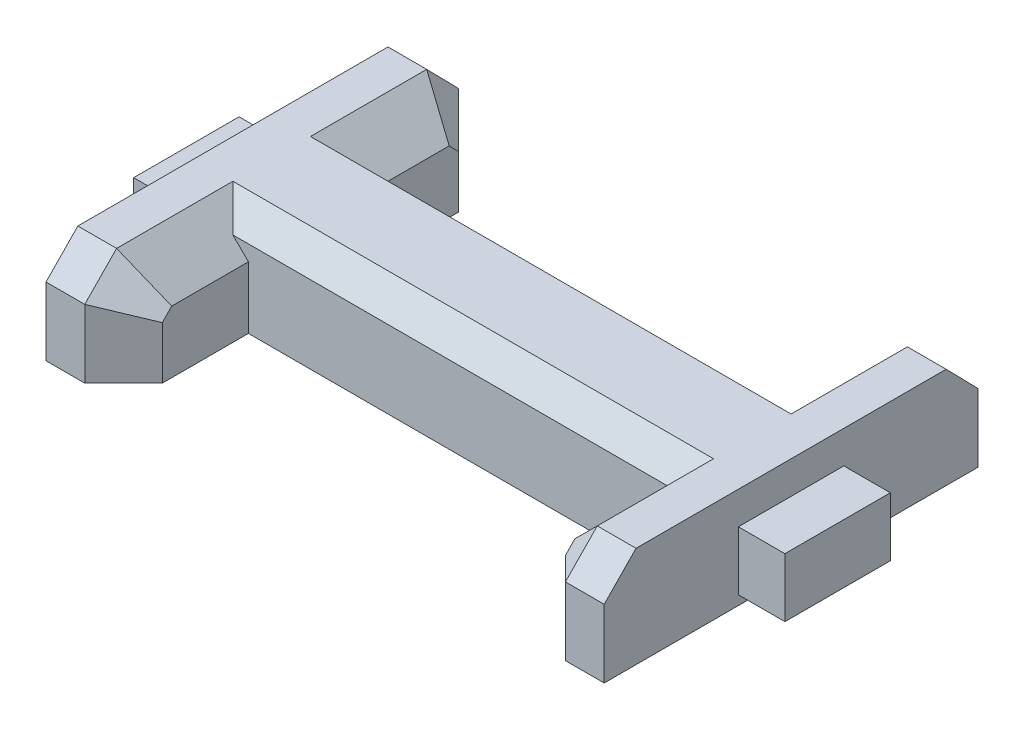
ISO-10303-21;
HEADER;
FILE_DESCRIPTION(('STEP AP214'),'2;1');
FILE_NAME('part.step','',(''),(''),'','','');
FILE_SCHEMA(('AUTOMOTIVE_DESIGN { 1 0 10303 214 1 1 1 1 }'));
ENDSEC;
DATA;
#1=APPLICATION_CONTEXT('core data for automotive mechanical design processes');
#2=APPLICATION_PROTOCOL_DEFINITION('international standard','automotive_design',2000,#1);
#3=PRODUCT_CONTEXT('',#1,'mechanical');
#4=PRODUCT('Part','Part','',(#3));
#5=PRODUCT_RELATED_PRODUCT_CATEGORY('part','',(#4));
#6=PRODUCT_DEFINITION_FORMATION('','',#4);
#7=PRODUCT_DEFINITION_CONTEXT('part definition',#1,'design');
#8=PRODUCT_DEFINITION('design','',#6,#7);
#9=PRODUCT_DEFINITION_SHAPE('','',#8);
#10=(LENGTH_UNIT() NAMED_UNIT(*) SI_UNIT(.MILLI.,.METRE.));
#11=(NAMED_UNIT(*) PLANE_ANGLE_UNIT() SI_UNIT($,.RADIAN.));
#12=(NAMED_UNIT(*) SI_UNIT($,.STERADIAN.) SOLID_ANGLE_UNIT());
#13=UNCERTAINTY_MEASURE_WITH_UNIT(LENGTH_MEASURE(1.E-05),#10,'distance_accuracy_value','');
#14=(GEOMETRIC_REPRESENTATION_CONTEXT(3) GLOBAL_UNCERTAINTY_ASSIGNED_CONTEXT((#13)) GLOBAL_UNIT_ASSIGNED_CONTEXT((#10,
#11,#12)) REPRESENTATION_CONTEXT('',''));
#15=CARTESIAN_POINT('',(0.,0.,0.));
#16=DIRECTION('',(0.,0.,1.));
#17=DIRECTION('',(1.,0.,0.));
#18=AXIS2_PLACEMENT_3D('',#15,#16,#17);
#19=CARTESIAN_POINT('',(-18.,-2.5,4.));
#20=DIRECTION('',(0.,0.,1.));
#21=DIRECTION('',(1.,0.,0.));
#22=AXIS2_PLACEMENT_3D('',#19,#20,#21);
#23=PLANE('',#22);
#24=DIRECTION('',(1.,0.,0.));
#25=VECTOR('',#24,1.);
#26=CARTESIAN_POINT('',(-18.,2.5,4.));
#27=LINE('',#26,#25);
#28=CARTESIAN_POINT('',(-14.,2.5,4.));
#29=VERTEX_POINT('',#28);
#30=CARTESIAN_POINT('',(14.,2.5,4.));
#31=VERTEX_POINT('',#30);
#32=EDGE_CURVE('E52',#29,#31,#27,.T.);
#33=ORIENTED_EDGE('',*,*,#32,.F.);
#34=DIRECTION('',(0.707106781186549,-0.707106781186546,0.));
#35=VECTOR('',#34,1.);
#36=CARTESIAN_POINT('',(-13.,1.5,4.));
#37=LINE('',#36,#35);
#38=CARTESIAN_POINT('',(-13.,1.5,4.));
#39=VERTEX_POINT('',#38);
#40=EDGE_CURVE('E11',#29,#39,#37,.T.);
#41=ORIENTED_EDGE('',*,*,#40,.T.);
#42=DIRECTION('',(0.,-1.,0.));
#43=VECTOR('',#42,1.);
#44=CARTESIAN_POINT('',(-13.,-2.5,4.));
#45=LINE('',#44,#43);
#46=CARTESIAN_POINT('',(-13.,-2.5,4.));
#47=VERTEX_POINT('',#46);
#48=EDGE_CURVE('E316',#39,#47,#45,.T.);
#49=ORIENTED_EDGE('',*,*,#48,.T.);
#50=DIRECTION('',(1.,0.,0.));
#51=VECTOR('',#50,1.);
#52=CARTESIAN_POINT('',(-18.,-2.5,4.));
#53=LINE('',#52,#51);
#54=CARTESIAN_POINT('',(13.,-2.5,4.));
#55=VERTEX_POINT('',#54);
#56=EDGE_CURVE('E413',#47,#55,#53,.T.);
#57=ORIENTED_EDGE('',*,*,#56,.T.);
#58=DIRECTION('',(0.,1.,0.));
#59=VECTOR('',#58,1.);
#60=CARTESIAN_POINT('',(13.,-2.5,4.));
#61=LINE('',#60,#59);
#62=CARTESIAN_POINT('',(13.,1.5,4.));
#63=VERTEX_POINT('',#62);
#64=EDGE_CURVE('E347',#55,#63,#61,.T.);
#65=ORIENTED_EDGE('',*,*,#64,.T.);
#66=DIRECTION('',(0.707106781186546,0.707106781186549,0.));
#67=VECTOR('',#66,1.);
#68=CARTESIAN_POINT('',(15.5,4.,4.));
#69=LINE('',#68,#67);
#70=EDGE_CURVE('E491',#63,#31,#69,.T.);
#71=ORIENTED_EDGE('',*,*,#70,.T.);
#72=EDGE_LOOP('',(#33,#41,#49,#57,#65,#71));
#73=FACE_BOUND('',#72,.T.);
#74=ADVANCED_FACE('F35',(#73),#23,.T.);
#75=CARTESIAN_POINT('',(-18.,-2.5,-4.));
#76=DIRECTION('',(0.,0.,-1.));
#77=DIRECTION('',(-1.,0.,0.));
#78=AXIS2_PLACEMENT_3D('',#75,#76,#77);
#79=PLANE('',#78);
#80=DIRECTION('',(-1.,0.,0.));
#81=VECTOR('',#80,1.);
#82=CARTESIAN_POINT('',(-18.,-2.5,-4.));
#83=LINE('',#82,#81);
#84=CARTESIAN_POINT('',(13.,-2.5,-4.));
#85=VERTEX_POINT('',#84);
#86=CARTESIAN_POINT('',(-13.,-2.5,-4.));
#87=VERTEX_POINT('',#86);
#88=EDGE_CURVE('E409',#85,#87,#83,.T.);
#89=ORIENTED_EDGE('',*,*,#88,.T.);
#90=DIRECTION('',(0.,1.,0.));
#91=VECTOR('',#90,1.);
#92=CARTESIAN_POINT('',(-13.,-2.5,-4.));
#93=LINE('',#92,#91);
#94=CARTESIAN_POINT('',(-13.,1.5,-4.));
#95=VERTEX_POINT('',#94);
#96=EDGE_CURVE('E306',#87,#95,#93,.T.);
#97=ORIENTED_EDGE('',*,*,#96,.T.);
#98=DIRECTION('',(-0.707106781186549,0.707106781186546,0.));
#99=VECTOR('',#98,1.);
#100=CARTESIAN_POINT('',(-13.,1.5,-4.));
#101=LINE('',#100,#99);
#102=CARTESIAN_POINT('',(-14.,2.5,-4.));
#103=VERTEX_POINT('',#102);
#104=EDGE_CURVE('E496',#95,#103,#101,.T.);
#105=ORIENTED_EDGE('',*,*,#104,.T.);
#106=DIRECTION('',(-1.,0.,0.));
#107=VECTOR('',#106,1.);
#108=CARTESIAN_POINT('',(-18.,2.5,-4.));
#109=LINE('',#108,#107);
#110=CARTESIAN_POINT('',(14.,2.5,-4.));
#111=VERTEX_POINT('',#110);
#112=EDGE_CURVE('E60',#111,#103,#109,.T.);
#113=ORIENTED_EDGE('',*,*,#112,.F.);
#114=DIRECTION('',(-0.707106781186546,-0.707106781186549,0.));
#115=VECTOR('',#114,1.);
#116=CARTESIAN_POINT('',(15.5,4.,-4.));
#117=LINE('',#116,#115);
#118=CARTESIAN_POINT('',(13.,1.5,-4.));
#119=VERTEX_POINT('',#118);
#120=EDGE_CURVE('E489',#111,#119,#117,.T.);
#121=ORIENTED_EDGE('',*,*,#120,.T.);
#122=DIRECTION('',(0.,-1.,0.));
#123=VECTOR('',#122,1.);
#124=CARTESIAN_POINT('',(13.,-2.5,-4.));
#125=LINE('',#124,#123);
#126=EDGE_CURVE('E336',#119,#85,#125,.T.);
#127=ORIENTED_EDGE('',*,*,#126,.T.);
#128=EDGE_LOOP('',(#89,#97,#105,#113,#121,#127));
#129=FACE_BOUND('',#128,.T.);
#130=ADVANCED_FACE('F610',(#129),#79,.T.);
#131=CARTESIAN_POINT('',(-18.,2.5,4.));
#132=DIRECTION('',(0.,0.707106781186547,0.707106781186547));
#133=DIRECTION('',(0.,-0.707106781186548,0.707106781186548));
#134=AXIS2_PLACEMENT_3D('',#131,#132,#133);
#135=PLANE('',#134);
#136=DIRECTION('',(1.,0.,0.));
#137=VECTOR('',#136,1.);
#138=CARTESIAN_POINT('',(-18.,4.,2.5));
#139=LINE('',#138,#137);
#140=CARTESIAN_POINT('',(-15.5,4.,2.5));
#141=VERTEX_POINT('',#140);
#142=CARTESIAN_POINT('',(15.5,4.,2.5));
#143=VERTEX_POINT('',#142);
#144=EDGE_CURVE('E352',#141,#143,#139,.T.);
#145=ORIENTED_EDGE('',*,*,#144,.F.);
#146=DIRECTION('',(0.577350269189628,-0.577350269189625,0.577350269189625));
#147=VECTOR('',#146,1.);
#148=CARTESIAN_POINT('',(-14.6666666666667,3.16666666666666,3.33333333333334));
#149=LINE('',#148,#147);
#150=EDGE_CURVE('E45',#141,#29,#149,.T.);
#151=ORIENTED_EDGE('',*,*,#150,.T.);
#152=ORIENTED_EDGE('',*,*,#32,.T.);
#153=DIRECTION('',(0.577350269189624,0.577350269189627,-0.577350269189627));
#154=VECTOR('',#153,1.);
#155=CARTESIAN_POINT('',(15.5,4.,2.5));
#156=LINE('',#155,#154);
#157=EDGE_CURVE('E493',#31,#143,#156,.T.);
#158=ORIENTED_EDGE('',*,*,#157,.T.);
#159=EDGE_LOOP('',(#145,#151,#152,#158));
#160=FACE_BOUND('',#159,.T.);
#161=ADVANCED_FACE('F531',(#160),#135,.T.);
#162=CARTESIAN_POINT('',(-18.,2.5,-4.));
#163=DIRECTION('',(0.,0.707106781186547,-0.707106781186548));
#164=DIRECTION('',(0.,0.707106781186548,0.707106781186547));
#165=AXIS2_PLACEMENT_3D('',#162,#163,#164);
#166=PLANE('',#165);
#167=ORIENTED_EDGE('',*,*,#112,.T.);
#168=DIRECTION('',(-0.577350269189628,0.577350269189625,0.577350269189625));
#169=VECTOR('',#168,1.);
#170=CARTESIAN_POINT('',(-14.6666666666667,3.16666666666666,-3.33333333333334));
#171=LINE('',#170,#169);
#172=CARTESIAN_POINT('',(-15.5,4.,-2.5));
#173=VERTEX_POINT('',#172);
#174=EDGE_CURVE('E498',#103,#173,#171,.T.);
#175=ORIENTED_EDGE('',*,*,#174,.T.);
#176=DIRECTION('',(1.,0.,0.));
#177=VECTOR('',#176,1.);
#178=CARTESIAN_POINT('',(-18.,4.,-2.5));
#179=LINE('',#178,#177);
#180=CARTESIAN_POINT('',(15.5,4.,-2.5));
#181=VERTEX_POINT('',#180);
#182=EDGE_CURVE('E281',#173,#181,#179,.T.);
#183=ORIENTED_EDGE('',*,*,#182,.T.);
#184=DIRECTION('',(-0.577350269189624,-0.577350269189627,-0.577350269189626));
#185=VECTOR('',#184,1.);
#186=CARTESIAN_POINT('',(17.1666666666667,5.66666666666667,-0.83333333333333));
#187=LINE('',#186,#185);
#188=EDGE_CURVE('E487',#181,#111,#187,.T.);
#189=ORIENTED_EDGE('',*,*,#188,.T.);
#190=EDGE_LOOP('',(#167,#175,#183,#189));
#191=FACE_BOUND('',#190,.T.);
#192=ADVANCED_FACE('F624',(#191),#166,.T.);
#193=CARTESIAN_POINT('',(18.,-2.5,4.));
#194=DIRECTION('',(1.,0.,0.));
#195=DIRECTION('',(0.,0.,-1.));
#196=AXIS2_PLACEMENT_3D('',#193,#194,#195);
#197=PLANE('',#196);
#198=DIRECTION('',(0.,0.,-1.));
#199=VECTOR('',#198,1.);
#200=CARTESIAN_POINT('',(18.,-2.5,4.));
#201=LINE('',#200,#199);
#202=CARTESIAN_POINT('',(18.,-2.5,12.0540269713533));
#203=VERTEX_POINT('',#202);
#204=CARTESIAN_POINT('',(18.,-2.5,-12.0540269713533));
#205=VERTEX_POINT('',#204);
#206=EDGE_CURVE('E406',#203,#205,#201,.T.);
#207=ORIENTED_EDGE('',*,*,#206,.T.);
#208=DIRECTION('',(0.,1.,0.));
#209=VECTOR('',#208,1.);
#210=CARTESIAN_POINT('',(18.,1.9,-12.0540269713533));
#211=LINE('',#210,#209);
#212=CARTESIAN_POINT('',(18.,1.9,-12.0540269713533));
#213=VERTEX_POINT('',#212);
#214=EDGE_CURVE('E328',#205,#213,#211,.T.);
#215=ORIENTED_EDGE('',*,*,#214,.T.);
#216=DIRECTION('',(0.,0.714888623408022,0.699238339997016));
#217=VECTOR('',#216,1.);
#218=CARTESIAN_POINT('',(18.,4.,-10.));
#219=LINE('',#218,#217);
#220=CARTESIAN_POINT('',(18.,4.,-10.));
#221=VERTEX_POINT('',#220);
#222=EDGE_CURVE('E331',#213,#221,#219,.T.);
#223=ORIENTED_EDGE('',*,*,#222,.T.);
#224=DIRECTION('',(0.,0.,1.));
#225=VECTOR('',#224,1.);
#226=CARTESIAN_POINT('',(18.,4.,2.5));
#227=LINE('',#226,#225);
#228=CARTESIAN_POINT('',(18.,4.,10.));
#229=VERTEX_POINT('',#228);
#230=EDGE_CURVE('E282',#221,#229,#227,.T.);
#231=ORIENTED_EDGE('',*,*,#230,.T.);
#232=DIRECTION('',(0.,-0.714888623408022,0.699238339997016));
#233=VECTOR('',#232,1.);
#234=CARTESIAN_POINT('',(18.,4.,10.));
#235=LINE('',#234,#233);
#236=CARTESIAN_POINT('',(18.,1.9,12.0540269713533));
#237=VERTEX_POINT('',#236);
#238=EDGE_CURVE('E318',#229,#237,#235,.T.);
#239=ORIENTED_EDGE('',*,*,#238,.T.);
#240=DIRECTION('',(0.,-1.,0.));
#241=VECTOR('',#240,1.);
#242=CARTESIAN_POINT('',(18.,1.9,12.0540269713533));
#243=LINE('',#242,#241);
#244=EDGE_CURVE('E325',#237,#203,#243,.T.);
#245=ORIENTED_EDGE('',*,*,#244,.T.);
#246=EDGE_LOOP('',(#207,#215,#223,#231,#239,#245));
#247=FACE_BOUND('',#246,.T.);
#248=DIRECTION('',(0.,1.,0.));
#249=VECTOR('',#248,1.);
#250=CARTESIAN_POINT('',(18.,-2.5,-3.4));
#251=LINE('',#250,#249);
#252=CARTESIAN_POINT('',(18.,-1.9,-3.4));
#253=VERTEX_POINT('',#252);
#254=CARTESIAN_POINT('',(18.,1.9,-3.4));
#255=VERTEX_POINT('',#254);
#256=EDGE_CURVE('E398',#253,#255,#251,.T.);
#257=ORIENTED_EDGE('',*,*,#256,.F.);
#258=DIRECTION('',(0.,0.,1.));
#259=VECTOR('',#258,1.);
#260=CARTESIAN_POINT('',(18.,-1.9,4.));
#261=LINE('',#260,#259);
#262=CARTESIAN_POINT('',(18.,-1.9,3.4));
#263=VERTEX_POINT('',#262);
#264=EDGE_CURVE('E396',#253,#263,#261,.T.);
#265=ORIENTED_EDGE('',*,*,#264,.T.);
#266=DIRECTION('',(0.,-1.,0.));
#267=VECTOR('',#266,1.);
#268=CARTESIAN_POINT('',(18.,-2.5,3.4));
#269=LINE('',#268,#267);
#270=CARTESIAN_POINT('',(18.,1.9,3.4));
#271=VERTEX_POINT('',#270);
#272=EDGE_CURVE('E401',#271,#263,#269,.T.);
#273=ORIENTED_EDGE('',*,*,#272,.F.);
#274=DIRECTION('',(0.,0.,1.));
#275=VECTOR('',#274,1.);
#276=CARTESIAN_POINT('',(18.,1.9,4.));
#277=LINE('',#276,#275);
#278=EDGE_CURVE('E387',#255,#271,#277,.T.);
#279=ORIENTED_EDGE('',*,*,#278,.F.);
#280=EDGE_LOOP('',(#257,#265,#273,#279));
#281=FACE_BOUND('',#280,.T.);
#282=ADVANCED_FACE('F553',(#247,#281),#197,.T.);
#283=CARTESIAN_POINT('',(-18.,-2.5,4.));
#284=DIRECTION('',(-1.,0.,0.));
#285=DIRECTION('',(0.,0.,1.));
#286=AXIS2_PLACEMENT_3D('',#283,#284,#285);
#287=PLANE('',#286);
#288=DIRECTION('',(0.,0.,1.));
#289=VECTOR('',#288,1.);
#290=CARTESIAN_POINT('',(-18.,-2.5,4.));
#291=LINE('',#290,#289);
#292=CARTESIAN_POINT('',(-18.,-2.5,-12.0540269713533));
#293=VERTEX_POINT('',#292);
#294=CARTESIAN_POINT('',(-18.,-2.5,12.0540269713533));
#295=VERTEX_POINT('',#294);
#296=EDGE_CURVE('E411',#293,#295,#291,.T.);
#297=ORIENTED_EDGE('',*,*,#296,.T.);
#298=DIRECTION('',(0.,-1.,0.));
#299=VECTOR('',#298,1.);
#300=CARTESIAN_POINT('',(-18.,1.9,12.0540269713533));
#301=LINE('',#300,#299);
#302=CARTESIAN_POINT('',(-18.,1.9,12.0540269713533));
#303=VERTEX_POINT('',#302);
#304=EDGE_CURVE('E289',#303,#295,#301,.T.);
#305=ORIENTED_EDGE('',*,*,#304,.F.);
#306=DIRECTION('',(0.,-0.714888623408022,0.699238339997016));
#307=VECTOR('',#306,1.);
#308=CARTESIAN_POINT('',(-18.,4.,10.));
#309=LINE('',#308,#307);
#310=CARTESIAN_POINT('',(-18.,4.,10.));
#311=VERTEX_POINT('',#310);
#312=EDGE_CURVE('E264',#311,#303,#309,.T.);
#313=ORIENTED_EDGE('',*,*,#312,.F.);
#314=DIRECTION('',(0.,0.,1.));
#315=VECTOR('',#314,1.);
#316=CARTESIAN_POINT('',(-18.,4.,2.5));
#317=LINE('',#316,#315);
#318=CARTESIAN_POINT('',(-18.,4.,-10.));
#319=VERTEX_POINT('',#318);
#320=EDGE_CURVE('E274',#319,#311,#317,.T.);
#321=ORIENTED_EDGE('',*,*,#320,.F.);
#322=DIRECTION('',(0.,0.714888623408022,0.699238339997016));
#323=VECTOR('',#322,1.);
#324=CARTESIAN_POINT('',(-18.,4.,-10.));
#325=LINE('',#324,#323);
#326=CARTESIAN_POINT('',(-18.,1.9,-12.0540269713533));
#327=VERTEX_POINT('',#326);
#328=EDGE_CURVE('E290',#327,#319,#325,.T.);
#329=ORIENTED_EDGE('',*,*,#328,.F.);
#330=DIRECTION('',(0.,1.,0.));
#331=VECTOR('',#330,1.);
#332=CARTESIAN_POINT('',(-18.,1.9,-12.0540269713533));
#333=LINE('',#332,#331);
#334=EDGE_CURVE('E293',#293,#327,#333,.T.);
#335=ORIENTED_EDGE('',*,*,#334,.F.);
#336=EDGE_LOOP('',(#297,#305,#313,#321,#329,#335));
#337=FACE_BOUND('',#336,.T.);
#338=DIRECTION('',(0.,1.,0.));
#339=VECTOR('',#338,1.);
#340=CARTESIAN_POINT('',(-18.,-2.5,3.4));
#341=LINE('',#340,#339);
#342=CARTESIAN_POINT('',(-18.,-1.9,3.4));
#343=VERTEX_POINT('',#342);
#344=CARTESIAN_POINT('',(-18.,1.9,3.4));
#345=VERTEX_POINT('',#344);
#346=EDGE_CURVE('E422',#343,#345,#341,.T.);
#347=ORIENTED_EDGE('',*,*,#346,.F.);
#348=DIRECTION('',(0.,0.,-1.));
#349=VECTOR('',#348,1.);
#350=CARTESIAN_POINT('',(-18.,-1.9,4.));
#351=LINE('',#350,#349);
#352=CARTESIAN_POINT('',(-18.,-1.9,-3.4));
#353=VERTEX_POINT('',#352);
#354=EDGE_CURVE('E425',#343,#353,#351,.T.);
#355=ORIENTED_EDGE('',*,*,#354,.T.);
#356=DIRECTION('',(0.,-1.,0.));
#357=VECTOR('',#356,1.);
#358=CARTESIAN_POINT('',(-18.,-2.5,-3.4));
#359=LINE('',#358,#357);
#360=CARTESIAN_POINT('',(-18.,1.9,-3.4));
#361=VERTEX_POINT('',#360);
#362=EDGE_CURVE('E419',#361,#353,#359,.T.);
#363=ORIENTED_EDGE('',*,*,#362,.F.);
#364=DIRECTION('',(0.,0.,-1.));
#365=VECTOR('',#364,1.);
#366=CARTESIAN_POINT('',(-18.,1.9,4.));
#367=LINE('',#366,#365);
#368=EDGE_CURVE('E416',#345,#361,#367,.T.);
#369=ORIENTED_EDGE('',*,*,#368,.F.);
#370=EDGE_LOOP('',(#347,#355,#363,#369));
#371=FACE_BOUND('',#370,.T.);
#372=ADVANCED_FACE('F286',(#337,#371),#287,.T.);
#373=CARTESIAN_POINT('',(0.,-2.5,0.));
#374=DIRECTION('',(0.,-1.,0.));
#375=DIRECTION('',(0.,0.,-1.));
#376=AXIS2_PLACEMENT_3D('',#373,#374,#375);
#377=PLANE('',#376);
#378=DIRECTION('',(0.,0.,-1.));
#379=VECTOR('',#378,1.);
#380=CARTESIAN_POINT('',(13.,-2.5,12.0540269713533));
#381=LINE('',#380,#379);
#382=CARTESIAN_POINT('',(13.,-2.5,-9.55402697135333));
#383=VERTEX_POINT('',#382);
#384=EDGE_CURVE('E322',#85,#383,#381,.T.);
#385=ORIENTED_EDGE('',*,*,#384,.T.);
#386=DIRECTION('',(0.707106781186547,0.,-0.707106781186549));
#387=VECTOR('',#386,1.);
#388=CARTESIAN_POINT('',(1.72298651432335,-2.5,1.72298651432335));
#389=LINE('',#388,#387);
#390=CARTESIAN_POINT('',(15.5,-2.5,-12.0540269713533));
#391=VERTEX_POINT('',#390);
#392=EDGE_CURVE('E442',#383,#391,#389,.T.);
#393=ORIENTED_EDGE('',*,*,#392,.T.);
#394=DIRECTION('',(1.,0.,0.));
#395=VECTOR('',#394,1.);
#396=CARTESIAN_POINT('',(13.,-2.5,-12.0540269713533));
#397=LINE('',#396,#395);
#398=EDGE_CURVE('E341',#391,#205,#397,.T.);
#399=ORIENTED_EDGE('',*,*,#398,.T.);
#400=ORIENTED_EDGE('',*,*,#206,.F.);
#401=DIRECTION('',(1.,0.,0.));
#402=VECTOR('',#401,1.);
#403=CARTESIAN_POINT('',(13.,-2.5,12.0540269713533));
#404=LINE('',#403,#402);
#405=CARTESIAN_POINT('',(15.5,-2.5,12.0540269713533));
#406=VERTEX_POINT('',#405);
#407=EDGE_CURVE('E343',#406,#203,#404,.T.);
#408=ORIENTED_EDGE('',*,*,#407,.F.);
#409=DIRECTION('',(-0.707106781186547,0.,-0.707106781186549));
#410=VECTOR('',#409,1.);
#411=CARTESIAN_POINT('',(1.72298651432335,-2.5,-1.72298651432335));
#412=LINE('',#411,#410);
#413=CARTESIAN_POINT('',(13.,-2.5,9.55402697135333));
#414=VERTEX_POINT('',#413);
#415=EDGE_CURVE('E440',#406,#414,#412,.T.);
#416=ORIENTED_EDGE('',*,*,#415,.T.);
#417=EDGE_CURVE('E319',#414,#55,#381,.T.);
#418=ORIENTED_EDGE('',*,*,#417,.T.);
#419=ORIENTED_EDGE('',*,*,#56,.F.);
#420=DIRECTION('',(0.,0.,-1.));
#421=VECTOR('',#420,1.);
#422=CARTESIAN_POINT('',(-13.,-2.5,12.0540269713533));
#423=LINE('',#422,#421);
#424=CARTESIAN_POINT('',(-13.,-2.5,9.55402697135333));
#425=VERTEX_POINT('',#424);
#426=EDGE_CURVE('E271',#425,#47,#423,.T.);
#427=ORIENTED_EDGE('',*,*,#426,.F.);
#428=DIRECTION('',(0.707106781186549,0.,-0.707106781186546));
#429=VECTOR('',#428,1.);
#430=CARTESIAN_POINT('',(-1.7229865143233,-2.5,-1.72298651432331));
#431=LINE('',#430,#429);
#432=CARTESIAN_POINT('',(-15.5,-2.5,12.0540269713533));
#433=VERTEX_POINT('',#432);
#434=EDGE_CURVE('E436',#425,#433,#431,.F.);
#435=ORIENTED_EDGE('',*,*,#434,.T.);
#436=DIRECTION('',(-1.,0.,0.));
#437=VECTOR('',#436,1.);
#438=CARTESIAN_POINT('',(-13.,-2.5,12.0540269713533));
#439=LINE('',#438,#437);
#440=EDGE_CURVE('E307',#433,#295,#439,.T.);
#441=ORIENTED_EDGE('',*,*,#440,.T.);
#442=ORIENTED_EDGE('',*,*,#296,.F.);
#443=DIRECTION('',(-1.,0.,0.));
#444=VECTOR('',#443,1.);
#445=CARTESIAN_POINT('',(-13.,-2.5,-12.0540269713533));
#446=LINE('',#445,#444);
#447=CARTESIAN_POINT('',(-15.5,-2.5,-12.0540269713533));
#448=VERTEX_POINT('',#447);
#449=EDGE_CURVE('E309',#448,#293,#446,.T.);
#450=ORIENTED_EDGE('',*,*,#449,.F.);
#451=DIRECTION('',(-0.707106781186549,0.,-0.707106781186546));
#452=VECTOR('',#451,1.);
#453=CARTESIAN_POINT('',(-1.7229865143233,-2.5,1.72298651432331));
#454=LINE('',#453,#452);
#455=CARTESIAN_POINT('',(-13.,-2.5,-9.55402697135333));
#456=VERTEX_POINT('',#455);
#457=EDGE_CURVE('E438',#448,#456,#454,.F.);
#458=ORIENTED_EDGE('',*,*,#457,.T.);
#459=EDGE_CURVE('E303',#87,#456,#423,.T.);
#460=ORIENTED_EDGE('',*,*,#459,.F.);
#461=ORIENTED_EDGE('',*,*,#88,.F.);
#462=EDGE_LOOP('',(#385,#393,#399,#400,#408,#416,#418,#419,#427,#435,#441,#442,#450,#458,#460,#461));
#463=FACE_BOUND('',#462,.T.);
#464=ADVANCED_FACE('F582',(#463),#377,.T.);
#465=CARTESIAN_POINT('',(-21.,-1.9,-3.4));
#466=DIRECTION('',(-1.,0.,0.));
#467=DIRECTION('',(0.,0.,1.));
#468=AXIS2_PLACEMENT_3D('',#465,#466,#467);
#469=PLANE('',#468);
#470=DIRECTION('',(0.,1.,0.));
#471=VECTOR('',#470,1.);
#472=CARTESIAN_POINT('',(-21.,-1.9,3.4));
#473=LINE('',#472,#471);
#474=CARTESIAN_POINT('',(-21.,-1.9,3.4));
#475=VERTEX_POINT('',#474);
#476=CARTESIAN_POINT('',(-21.,1.9,3.4));
#477=VERTEX_POINT('',#476);
#478=EDGE_CURVE('E388',#475,#477,#473,.T.);
#479=ORIENTED_EDGE('',*,*,#478,.T.);
#480=DIRECTION('',(0.,0.,1.));
#481=VECTOR('',#480,1.);
#482=CARTESIAN_POINT('',(-21.,1.9,-3.4));
#483=LINE('',#482,#481);
#484=CARTESIAN_POINT('',(-21.,1.9,-3.4));
#485=VERTEX_POINT('',#484);
#486=EDGE_CURVE('E362',#485,#477,#483,.T.);
#487=ORIENTED_EDGE('',*,*,#486,.F.);
#488=DIRECTION('',(0.,1.,0.));
#489=VECTOR('',#488,1.);
#490=CARTESIAN_POINT('',(-21.,-1.9,-3.4));
#491=LINE('',#490,#489);
#492=CARTESIAN_POINT('',(-21.,-1.9,-3.4));
#493=VERTEX_POINT('',#492);
#494=EDGE_CURVE('E390',#493,#485,#491,.T.);
#495=ORIENTED_EDGE('',*,*,#494,.F.);
#496=DIRECTION('',(0.,0.,1.));
#497=VECTOR('',#496,1.);
#498=CARTESIAN_POINT('',(-21.,-1.9,-3.4));
#499=LINE('',#498,#497);
#500=EDGE_CURVE('E376',#493,#475,#499,.T.);
#501=ORIENTED_EDGE('',*,*,#500,.T.);
#502=EDGE_LOOP('',(#479,#487,#495,#501));
#503=FACE_BOUND('',#502,.T.);
#504=ADVANCED_FACE('F689',(#503),#469,.T.);
#505=CARTESIAN_POINT('',(0.,-1.9,0.));
#506=DIRECTION('',(0.,1.,0.));
#507=DIRECTION('',(0.,0.,1.));
#508=AXIS2_PLACEMENT_3D('',#505,#506,#507);
#509=PLANE('',#508);
#510=ORIENTED_EDGE('',*,*,#354,.F.);
#511=DIRECTION('',(1.,0.,0.));
#512=VECTOR('',#511,1.);
#513=CARTESIAN_POINT('',(-21.,-1.9,3.4));
#514=LINE('',#513,#512);
#515=EDGE_CURVE('E380',#475,#343,#514,.T.);
#516=ORIENTED_EDGE('',*,*,#515,.F.);
#517=ORIENTED_EDGE('',*,*,#500,.F.);
#518=DIRECTION('',(-1.,0.,0.));
#519=VECTOR('',#518,1.);
#520=CARTESIAN_POINT('',(-21.,-1.9,-3.4));
#521=LINE('',#520,#519);
#522=EDGE_CURVE('E372',#353,#493,#521,.T.);
#523=ORIENTED_EDGE('',*,*,#522,.F.);
#524=EDGE_LOOP('',(#510,#516,#517,#523));
#525=FACE_BOUND('',#524,.T.);
#526=ADVANCED_FACE('F684',(#525),#509,.F.);
#527=CARTESIAN_POINT('',(0.,1.9,0.));
#528=DIRECTION('',(0.,1.,0.));
#529=DIRECTION('',(0.,0.,1.));
#530=AXIS2_PLACEMENT_3D('',#527,#528,#529);
#531=PLANE('',#530);
#532=DIRECTION('',(1.,0.,0.));
#533=VECTOR('',#532,1.);
#534=CARTESIAN_POINT('',(-21.,1.9,3.4));
#535=LINE('',#534,#533);
#536=EDGE_CURVE('E366',#477,#345,#535,.T.);
#537=ORIENTED_EDGE('',*,*,#536,.T.);
#538=ORIENTED_EDGE('',*,*,#368,.T.);
#539=DIRECTION('',(-1.,0.,0.));
#540=VECTOR('',#539,1.);
#541=CARTESIAN_POINT('',(-21.,1.9,-3.4));
#542=LINE('',#541,#540);
#543=EDGE_CURVE('E358',#361,#485,#542,.T.);
#544=ORIENTED_EDGE('',*,*,#543,.T.);
#545=ORIENTED_EDGE('',*,*,#486,.T.);
#546=EDGE_LOOP('',(#537,#538,#544,#545));
#547=FACE_BOUND('',#546,.T.);
#548=ADVANCED_FACE('F680',(#547),#531,.T.);
#549=CARTESIAN_POINT('',(-21.,-1.9,-3.4));
#550=DIRECTION('',(0.,0.,-1.));
#551=DIRECTION('',(-1.,0.,0.));
#552=AXIS2_PLACEMENT_3D('',#549,#550,#551);
#553=PLANE('',#552);
#554=ORIENTED_EDGE('',*,*,#543,.F.);
#555=ORIENTED_EDGE('',*,*,#362,.T.);
#556=ORIENTED_EDGE('',*,*,#522,.T.);
#557=ORIENTED_EDGE('',*,*,#494,.T.);
#558=EDGE_LOOP('',(#554,#555,#556,#557));
#559=FACE_BOUND('',#558,.T.);
#560=ADVANCED_FACE('F683',(#559),#553,.T.);
#561=CARTESIAN_POINT('',(-21.,-1.9,3.4));
#562=DIRECTION('',(0.,0.,1.));
#563=DIRECTION('',(1.,0.,0.));
#564=AXIS2_PLACEMENT_3D('',#561,#562,#563);
#565=PLANE('',#564);
#566=ORIENTED_EDGE('',*,*,#515,.T.);
#567=ORIENTED_EDGE('',*,*,#346,.T.);
#568=ORIENTED_EDGE('',*,*,#536,.F.);
#569=ORIENTED_EDGE('',*,*,#478,.F.);
#570=EDGE_LOOP('',(#566,#567,#568,#569));
#571=FACE_BOUND('',#570,.T.);
#572=ADVANCED_FACE('F692',(#571),#565,.T.);
#573=CARTESIAN_POINT('',(21.,1.9,3.4));
#574=VERTEX_POINT('',#573);
#575=EDGE_CURVE('E365',#271,#574,#535,.T.);
#576=ORIENTED_EDGE('',*,*,#575,.F.);
#577=ORIENTED_EDGE('',*,*,#272,.T.);
#578=CARTESIAN_POINT('',(21.,-1.9,3.4));
#579=VERTEX_POINT('',#578);
#580=EDGE_CURVE('E379',#263,#579,#514,.T.);
#581=ORIENTED_EDGE('',*,*,#580,.T.);
#582=DIRECTION('',(0.,1.,0.));
#583=VECTOR('',#582,1.);
#584=CARTESIAN_POINT('',(21.,-1.9,3.4));
#585=LINE('',#584,#583);
#586=EDGE_CURVE('E384',#579,#574,#585,.T.);
#587=ORIENTED_EDGE('',*,*,#586,.T.);
#588=EDGE_LOOP('',(#576,#577,#581,#587));
#589=FACE_BOUND('',#588,.T.);
#590=ADVANCED_FACE('F695',(#589),#565,.T.);
#591=CARTESIAN_POINT('',(21.,-1.9,-3.4));
#592=VERTEX_POINT('',#591);
#593=EDGE_CURVE('E373',#592,#253,#521,.T.);
#594=ORIENTED_EDGE('',*,*,#593,.T.);
#595=ORIENTED_EDGE('',*,*,#256,.T.);
#596=CARTESIAN_POINT('',(21.,1.9,-3.4));
#597=VERTEX_POINT('',#596);
#598=EDGE_CURVE('E359',#597,#255,#542,.T.);
#599=ORIENTED_EDGE('',*,*,#598,.F.);
#600=DIRECTION('',(0.,1.,0.));
#601=VECTOR('',#600,1.);
#602=CARTESIAN_POINT('',(21.,-1.9,-3.4));
#603=LINE('',#602,#601);
#604=EDGE_CURVE('E383',#592,#597,#603,.T.);
#605=ORIENTED_EDGE('',*,*,#604,.F.);
#606=EDGE_LOOP('',(#594,#595,#599,#605));
#607=FACE_BOUND('',#606,.T.);
#608=ADVANCED_FACE('F702',(#607),#553,.T.);
#609=ORIENTED_EDGE('',*,*,#264,.F.);
#610=ORIENTED_EDGE('',*,*,#593,.F.);
#611=DIRECTION('',(0.,0.,-1.));
#612=VECTOR('',#611,1.);
#613=CARTESIAN_POINT('',(21.,-1.9,-3.4));
#614=LINE('',#613,#612);
#615=EDGE_CURVE('E369',#579,#592,#614,.T.);
#616=ORIENTED_EDGE('',*,*,#615,.F.);
#617=ORIENTED_EDGE('',*,*,#580,.F.);
#618=EDGE_LOOP('',(#609,#610,#616,#617));
#619=FACE_BOUND('',#618,.T.);
#620=ADVANCED_FACE('F691',(#619),#509,.F.);
#621=ORIENTED_EDGE('',*,*,#598,.T.);
#622=ORIENTED_EDGE('',*,*,#278,.T.);
#623=ORIENTED_EDGE('',*,*,#575,.T.);
#624=DIRECTION('',(0.,0.,-1.));
#625=VECTOR('',#624,1.);
#626=CARTESIAN_POINT('',(21.,1.9,-3.4));
#627=LINE('',#626,#625);
#628=EDGE_CURVE('E354',#574,#597,#627,.T.);
#629=ORIENTED_EDGE('',*,*,#628,.T.);
#630=EDGE_LOOP('',(#621,#622,#623,#629));
#631=FACE_BOUND('',#630,.T.);
#632=ADVANCED_FACE('F686',(#631),#531,.T.);
#633=CARTESIAN_POINT('',(21.,-1.9,-3.4));
#634=DIRECTION('',(1.,0.,0.));
#635=DIRECTION('',(0.,0.,-1.));
#636=AXIS2_PLACEMENT_3D('',#633,#634,#635);
#637=PLANE('',#636);
#638=ORIENTED_EDGE('',*,*,#604,.T.);
#639=ORIENTED_EDGE('',*,*,#628,.F.);
#640=ORIENTED_EDGE('',*,*,#586,.F.);
#641=ORIENTED_EDGE('',*,*,#615,.T.);
#642=EDGE_LOOP('',(#638,#639,#640,#641));
#643=FACE_BOUND('',#642,.T.);
#644=ADVANCED_FACE('F677',(#643),#637,.T.);
#645=CARTESIAN_POINT('',(-18.,4.,2.5));
#646=DIRECTION('',(0.,1.,0.));
#647=DIRECTION('',(0.,0.,1.));
#648=AXIS2_PLACEMENT_3D('',#645,#646,#647);
#649=PLANE('',#648);
#650=DIRECTION('',(1.,0.,0.));
#651=VECTOR('',#650,1.);
#652=CARTESIAN_POINT('',(13.,4.,-10.));
#653=LINE('',#652,#651);
#654=CARTESIAN_POINT('',(15.5,4.,-10.));
#655=VERTEX_POINT('',#654);
#656=EDGE_CURVE('E337',#655,#221,#653,.T.);
#657=ORIENTED_EDGE('',*,*,#656,.F.);
#658=DIRECTION('',(0.,0.,1.));
#659=VECTOR('',#658,1.);
#660=CARTESIAN_POINT('',(15.5,4.,-2.5));
#661=LINE('',#660,#659);
#662=EDGE_CURVE('E452',#655,#181,#661,.T.);
#663=ORIENTED_EDGE('',*,*,#662,.T.);
#664=ORIENTED_EDGE('',*,*,#182,.F.);
#665=DIRECTION('',(0.,0.,-1.));
#666=VECTOR('',#665,1.);
#667=CARTESIAN_POINT('',(-15.5,4.,-10.));
#668=LINE('',#667,#666);
#669=CARTESIAN_POINT('',(-15.5,4.,-10.));
#670=VERTEX_POINT('',#669);
#671=EDGE_CURVE('E448',#173,#670,#668,.T.);
#672=ORIENTED_EDGE('',*,*,#671,.T.);
#673=DIRECTION('',(-1.,0.,0.));
#674=VECTOR('',#673,1.);
#675=CARTESIAN_POINT('',(-13.,4.,-10.));
#676=LINE('',#675,#674);
#677=EDGE_CURVE('E270',#670,#319,#676,.T.);
#678=ORIENTED_EDGE('',*,*,#677,.T.);
#679=ORIENTED_EDGE('',*,*,#320,.T.);
#680=DIRECTION('',(-1.,0.,0.));
#681=VECTOR('',#680,1.);
#682=CARTESIAN_POINT('',(-13.,4.,10.));
#683=LINE('',#682,#681);
#684=CARTESIAN_POINT('',(-15.5,4.,10.));
#685=VERTEX_POINT('',#684);
#686=EDGE_CURVE('E259',#685,#311,#683,.T.);
#687=ORIENTED_EDGE('',*,*,#686,.F.);
#688=DIRECTION('',(0.,0.,-1.));
#689=VECTOR('',#688,1.);
#690=CARTESIAN_POINT('',(-15.5,4.,2.5));
#691=LINE('',#690,#689);
#692=EDGE_CURVE('E446',#685,#141,#691,.T.);
#693=ORIENTED_EDGE('',*,*,#692,.T.);
#694=ORIENTED_EDGE('',*,*,#144,.T.);
#695=DIRECTION('',(0.,0.,1.));
#696=VECTOR('',#695,1.);
#697=CARTESIAN_POINT('',(15.5,4.,10.));
#698=LINE('',#697,#696);
#699=CARTESIAN_POINT('',(15.5,4.,10.));
#700=VERTEX_POINT('',#699);
#701=EDGE_CURVE('E450',#143,#700,#698,.T.);
#702=ORIENTED_EDGE('',*,*,#701,.T.);
#703=DIRECTION('',(1.,0.,0.));
#704=VECTOR('',#703,1.);
#705=CARTESIAN_POINT('',(13.,4.,10.));
#706=LINE('',#705,#704);
#707=EDGE_CURVE('E334',#700,#229,#706,.T.);
#708=ORIENTED_EDGE('',*,*,#707,.T.);
#709=ORIENTED_EDGE('',*,*,#230,.F.);
#710=EDGE_LOOP('',(#657,#663,#664,#672,#678,#679,#687,#693,#694,#702,#708,#709));
#711=FACE_BOUND('',#710,.T.);
#712=ADVANCED_FACE('F276',(#711),#649,.T.);
#713=CARTESIAN_POINT('',(13.,4.,-10.));
#714=DIRECTION('',(0.,0.699238339997016,-0.714888623408022));
#715=DIRECTION('',(0.,0.714888623408022,0.699238339997016));
#716=AXIS2_PLACEMENT_3D('',#713,#714,#715);
#717=PLANE('',#716);
#718=DIRECTION('',(1.,0.,0.));
#719=VECTOR('',#718,1.);
#720=CARTESIAN_POINT('',(13.,1.9,-12.0540269713533));
#721=LINE('',#720,#719);
#722=CARTESIAN_POINT('',(15.5,1.9,-12.0540269713533));
#723=VERTEX_POINT('',#722);
#724=EDGE_CURVE('E339',#723,#213,#721,.T.);
#725=ORIENTED_EDGE('',*,*,#724,.F.);
#726=DIRECTION('',(0.,0.714888623408022,0.699238339997016));
#727=VECTOR('',#726,1.);
#728=CARTESIAN_POINT('',(15.5,4.,-10.));
#729=LINE('',#728,#727);
#730=EDGE_CURVE('E444',#723,#655,#729,.T.);
#731=ORIENTED_EDGE('',*,*,#730,.T.);
#732=ORIENTED_EDGE('',*,*,#656,.T.);
#733=ORIENTED_EDGE('',*,*,#222,.F.);
#734=EDGE_LOOP('',(#725,#731,#732,#733));
#735=FACE_BOUND('',#734,.T.);
#736=ADVANCED_FACE('F664',(#735),#717,.T.);
#737=CARTESIAN_POINT('',(13.,1.9,-12.0540269713533));
#738=DIRECTION('',(0.,0.,-1.));
#739=DIRECTION('',(-1.,0.,0.));
#740=AXIS2_PLACEMENT_3D('',#737,#738,#739);
#741=PLANE('',#740);
#742=ORIENTED_EDGE('',*,*,#398,.F.);
#743=DIRECTION('',(0.,1.,0.));
#744=VECTOR('',#743,1.);
#745=CARTESIAN_POINT('',(15.5,1.9,-12.0540269713533));
#746=LINE('',#745,#744);
#747=EDGE_CURVE('E427',#391,#723,#746,.T.);
#748=ORIENTED_EDGE('',*,*,#747,.T.);
#749=ORIENTED_EDGE('',*,*,#724,.T.);
#750=ORIENTED_EDGE('',*,*,#214,.F.);
#751=EDGE_LOOP('',(#742,#748,#749,#750));
#752=FACE_BOUND('',#751,.T.);
#753=ADVANCED_FACE('F586',(#752),#741,.T.);
#754=CARTESIAN_POINT('',(13.,0.,0.));
#755=DIRECTION('',(1.,0.,0.));
#756=DIRECTION('',(0.,0.,-1.));
#757=AXIS2_PLACEMENT_3D('',#754,#755,#756);
#758=PLANE('',#757);
#759=DIRECTION('',(0.,-0.714888623408022,-0.699238339997016));
#760=VECTOR('',#759,1.);
#761=CARTESIAN_POINT('',(13.,0.151904150007459,-10.2668054128333));
#762=LINE('',#761,#760);
#763=CARTESIAN_POINT('',(13.,1.5,-8.94822196718843));
#764=VERTEX_POINT('',#763);
#765=CARTESIAN_POINT('',(13.,0.880635928111457,-9.55402697135333));
#766=VERTEX_POINT('',#765);
#767=EDGE_CURVE('E432',#764,#766,#762,.T.);
#768=ORIENTED_EDGE('',*,*,#767,.T.);
#769=DIRECTION('',(0.,-1.,0.));
#770=VECTOR('',#769,1.);
#771=CARTESIAN_POINT('',(13.,-2.5,-9.55402697135333));
#772=LINE('',#771,#770);
#773=EDGE_CURVE('E434',#766,#383,#772,.T.);
#774=ORIENTED_EDGE('',*,*,#773,.T.);
#775=ORIENTED_EDGE('',*,*,#384,.F.);
#776=ORIENTED_EDGE('',*,*,#126,.F.);
#777=DIRECTION('',(0.,0.,-1.));
#778=VECTOR('',#777,1.);
#779=CARTESIAN_POINT('',(13.,1.5,-10.));
#780=LINE('',#779,#778);
#781=EDGE_CURVE('E430',#119,#764,#780,.T.);
#782=ORIENTED_EDGE('',*,*,#781,.T.);
#783=EDGE_LOOP('',(#768,#774,#775,#776,#782));
#784=FACE_BOUND('',#783,.T.);
#785=ADVANCED_FACE('F572',(#784),#758,.F.);
#786=ORIENTED_EDGE('',*,*,#417,.F.);
#787=DIRECTION('',(0.,1.,0.));
#788=VECTOR('',#787,1.);
#789=CARTESIAN_POINT('',(13.,1.9,9.55402697135333));
#790=LINE('',#789,#788);
#791=CARTESIAN_POINT('',(13.,0.880635928111457,9.55402697135333));
#792=VERTEX_POINT('',#791);
#793=EDGE_CURVE('E462',#414,#792,#790,.T.);
#794=ORIENTED_EDGE('',*,*,#793,.T.);
#795=DIRECTION('',(0.,0.714888623408022,-0.699238339997016));
#796=VECTOR('',#795,1.);
#797=CARTESIAN_POINT('',(13.,2.25190415000746,8.21277844147994));
#798=LINE('',#797,#796);
#799=CARTESIAN_POINT('',(13.,1.5,8.94822196718843));
#800=VERTEX_POINT('',#799);
#801=EDGE_CURVE('E460',#792,#800,#798,.T.);
#802=ORIENTED_EDGE('',*,*,#801,.T.);
#803=DIRECTION('',(0.,0.,-1.));
#804=VECTOR('',#803,1.);
#805=CARTESIAN_POINT('',(13.,1.5,2.5));
#806=LINE('',#805,#804);
#807=EDGE_CURVE('E458',#800,#63,#806,.T.);
#808=ORIENTED_EDGE('',*,*,#807,.T.);
#809=ORIENTED_EDGE('',*,*,#64,.F.);
#810=EDGE_LOOP('',(#786,#794,#802,#808,#809));
#811=FACE_BOUND('',#810,.T.);
#812=ADVANCED_FACE('F594',(#811),#758,.F.);
#813=CARTESIAN_POINT('',(13.,4.,10.));
#814=DIRECTION('',(0.,0.699238339997016,0.714888623408022));
#815=DIRECTION('',(0.,-0.714888623408022,0.699238339997016));
#816=AXIS2_PLACEMENT_3D('',#813,#814,#815);
#817=PLANE('',#816);
#818=ORIENTED_EDGE('',*,*,#707,.F.);
#819=DIRECTION('',(0.,-0.714888623408022,0.699238339997016));
#820=VECTOR('',#819,1.);
#821=CARTESIAN_POINT('',(15.5,1.9,12.0540269713533));
#822=LINE('',#821,#820);
#823=CARTESIAN_POINT('',(15.5,1.9,12.0540269713533));
#824=VERTEX_POINT('',#823);
#825=EDGE_CURVE('E464',#700,#824,#822,.T.);
#826=ORIENTED_EDGE('',*,*,#825,.T.);
#827=DIRECTION('',(1.,0.,0.));
#828=VECTOR('',#827,1.);
#829=CARTESIAN_POINT('',(13.,1.9,12.0540269713533));
#830=LINE('',#829,#828);
#831=EDGE_CURVE('E321',#824,#237,#830,.T.);
#832=ORIENTED_EDGE('',*,*,#831,.T.);
#833=ORIENTED_EDGE('',*,*,#238,.F.);
#834=EDGE_LOOP('',(#818,#826,#832,#833));
#835=FACE_BOUND('',#834,.T.);
#836=ADVANCED_FACE('F545',(#835),#817,.T.);
#837=CARTESIAN_POINT('',(13.,1.9,12.0540269713533));
#838=DIRECTION('',(0.,0.,1.));
#839=DIRECTION('',(1.,0.,0.));
#840=AXIS2_PLACEMENT_3D('',#837,#838,#839);
#841=PLANE('',#840);
#842=ORIENTED_EDGE('',*,*,#831,.F.);
#843=DIRECTION('',(0.,-1.,0.));
#844=VECTOR('',#843,1.);
#845=CARTESIAN_POINT('',(15.5,-2.5,12.0540269713533));
#846=LINE('',#845,#844);
#847=EDGE_CURVE('E455',#824,#406,#846,.T.);
#848=ORIENTED_EDGE('',*,*,#847,.T.);
#849=ORIENTED_EDGE('',*,*,#407,.T.);
#850=ORIENTED_EDGE('',*,*,#244,.F.);
#851=EDGE_LOOP('',(#842,#848,#849,#850));
#852=FACE_BOUND('',#851,.T.);
#853=ADVANCED_FACE('F549',(#852),#841,.T.);
#854=CARTESIAN_POINT('',(-13.,1.9,-12.0540269713533));
#855=DIRECTION('',(0.,0.,1.));
#856=DIRECTION('',(1.,0.,0.));
#857=AXIS2_PLACEMENT_3D('',#854,#855,#856);
#858=PLANE('',#857);
#859=DIRECTION('',(-1.,0.,0.));
#860=VECTOR('',#859,1.);
#861=CARTESIAN_POINT('',(-13.,1.9,-12.0540269713533));
#862=LINE('',#861,#860);
#863=CARTESIAN_POINT('',(-15.5,1.9,-12.0540269713533));
#864=VERTEX_POINT('',#863);
#865=EDGE_CURVE('E311',#864,#327,#862,.T.);
#866=ORIENTED_EDGE('',*,*,#865,.F.);
#867=DIRECTION('',(0.,-1.,0.));
#868=VECTOR('',#867,1.);
#869=CARTESIAN_POINT('',(-15.5,1.9,-12.0540269713533));
#870=LINE('',#869,#868);
#871=EDGE_CURVE('E473',#864,#448,#870,.T.);
#872=ORIENTED_EDGE('',*,*,#871,.T.);
#873=ORIENTED_EDGE('',*,*,#449,.T.);
#874=ORIENTED_EDGE('',*,*,#334,.T.);
#875=EDGE_LOOP('',(#866,#872,#873,#874));
#876=FACE_BOUND('',#875,.T.);
#877=ADVANCED_FACE('F654',(#876),#858,.F.);
#878=CARTESIAN_POINT('',(-13.,4.,-10.));
#879=DIRECTION('',(0.,-0.699238339997016,0.714888623408022));
#880=DIRECTION('',(0.,-0.714888623408022,-0.699238339997016));
#881=AXIS2_PLACEMENT_3D('',#878,#879,#880);
#882=PLANE('',#881);
#883=ORIENTED_EDGE('',*,*,#677,.F.);
#884=DIRECTION('',(0.,-0.714888623408022,-0.699238339997016));
#885=VECTOR('',#884,1.);
#886=CARTESIAN_POINT('',(-15.5,4.,-10.));
#887=LINE('',#886,#885);
#888=EDGE_CURVE('E475',#670,#864,#887,.T.);
#889=ORIENTED_EDGE('',*,*,#888,.T.);
#890=ORIENTED_EDGE('',*,*,#865,.T.);
#891=ORIENTED_EDGE('',*,*,#328,.T.);
#892=EDGE_LOOP('',(#883,#889,#890,#891));
#893=FACE_BOUND('',#892,.T.);
#894=ADVANCED_FACE('F657',(#893),#882,.F.);
#895=CARTESIAN_POINT('',(-13.,0.,0.));
#896=DIRECTION('',(-1.,0.,0.));
#897=DIRECTION('',(0.,0.,-1.));
#898=AXIS2_PLACEMENT_3D('',#895,#896,#897);
#899=PLANE('',#898);
#900=ORIENTED_EDGE('',*,*,#459,.T.);
#901=DIRECTION('',(0.,1.,0.));
#902=VECTOR('',#901,1.);
#903=CARTESIAN_POINT('',(-13.,0.,-9.55402697135333));
#904=LINE('',#903,#902);
#905=CARTESIAN_POINT('',(-13.,0.880635928111457,-9.55402697135333));
#906=VERTEX_POINT('',#905);
#907=EDGE_CURVE('E470',#456,#906,#904,.T.);
#908=ORIENTED_EDGE('',*,*,#907,.T.);
#909=DIRECTION('',(0.,0.714888623408022,0.699238339997016));
#910=VECTOR('',#909,1.);
#911=CARTESIAN_POINT('',(-13.,5.20641651764037,-5.32294601752043));
#912=LINE('',#911,#910);
#913=CARTESIAN_POINT('',(-13.,1.5,-8.94822196718843));
#914=VERTEX_POINT('',#913);
#915=EDGE_CURVE('E468',#906,#914,#912,.T.);
#916=ORIENTED_EDGE('',*,*,#915,.T.);
#917=DIRECTION('',(0.,0.,1.));
#918=VECTOR('',#917,1.);
#919=CARTESIAN_POINT('',(-13.,1.5,-2.5));
#920=LINE('',#919,#918);
#921=EDGE_CURVE('E466',#914,#95,#920,.T.);
#922=ORIENTED_EDGE('',*,*,#921,.T.);
#923=ORIENTED_EDGE('',*,*,#96,.F.);
#924=EDGE_LOOP('',(#900,#908,#916,#922,#923));
#925=FACE_BOUND('',#924,.T.);
#926=ADVANCED_FACE('F653',(#925),#899,.F.);
#927=DIRECTION('',(0.,-0.714888623408022,0.699238339997016));
#928=VECTOR('',#927,1.);
#929=CARTESIAN_POINT('',(-13.,5.20641651764037,5.32294601752043));
#930=LINE('',#929,#928);
#931=CARTESIAN_POINT('',(-13.,1.5,8.94822196718844));
#932=VERTEX_POINT('',#931);
#933=CARTESIAN_POINT('',(-13.,0.88063592811146,9.55402697135333));
#934=VERTEX_POINT('',#933);
#935=EDGE_CURVE('E479',#932,#934,#930,.T.);
#936=ORIENTED_EDGE('',*,*,#935,.T.);
#937=DIRECTION('',(0.,-1.,0.));
#938=VECTOR('',#937,1.);
#939=CARTESIAN_POINT('',(-13.,0.,9.55402697135333));
#940=LINE('',#939,#938);
#941=EDGE_CURVE('E481',#934,#425,#940,.T.);
#942=ORIENTED_EDGE('',*,*,#941,.T.);
#943=ORIENTED_EDGE('',*,*,#426,.T.);
#944=ORIENTED_EDGE('',*,*,#48,.F.);
#945=DIRECTION('',(0.,0.,1.));
#946=VECTOR('',#945,1.);
#947=CARTESIAN_POINT('',(-13.,1.5,10.));
#948=LINE('',#947,#946);
#949=EDGE_CURVE('E477',#39,#932,#948,.T.);
#950=ORIENTED_EDGE('',*,*,#949,.T.);
#951=EDGE_LOOP('',(#936,#942,#943,#944,#950));
#952=FACE_BOUND('',#951,.T.);
#953=ADVANCED_FACE('F648',(#952),#899,.F.);
#954=CARTESIAN_POINT('',(-13.,4.,10.));
#955=DIRECTION('',(0.,-0.699238339997016,-0.714888623408022));
#956=DIRECTION('',(0.,0.714888623408022,-0.699238339997016));
#957=AXIS2_PLACEMENT_3D('',#954,#955,#956);
#958=PLANE('',#957);
#959=DIRECTION('',(-1.,0.,0.));
#960=VECTOR('',#959,1.);
#961=CARTESIAN_POINT('',(-13.,1.9,12.0540269713533));
#962=LINE('',#961,#960);
#963=CARTESIAN_POINT('',(-15.5,1.9,12.0540269713533));
#964=VERTEX_POINT('',#963);
#965=EDGE_CURVE('E304',#964,#303,#962,.T.);
#966=ORIENTED_EDGE('',*,*,#965,.F.);
#967=DIRECTION('',(0.,0.714888623408022,-0.699238339997016));
#968=VECTOR('',#967,1.);
#969=CARTESIAN_POINT('',(-15.5,4.,10.));
#970=LINE('',#969,#968);
#971=EDGE_CURVE('E266',#964,#685,#970,.T.);
#972=ORIENTED_EDGE('',*,*,#971,.T.);
#973=ORIENTED_EDGE('',*,*,#686,.T.);
#974=ORIENTED_EDGE('',*,*,#312,.T.);
#975=EDGE_LOOP('',(#966,#972,#973,#974));
#976=FACE_BOUND('',#975,.T.);
#977=ADVANCED_FACE('F262',(#976),#958,.F.);
#978=CARTESIAN_POINT('',(-13.,1.9,12.0540269713533));
#979=DIRECTION('',(0.,0.,-1.));
#980=DIRECTION('',(-1.,0.,0.));
#981=AXIS2_PLACEMENT_3D('',#978,#979,#980);
#982=PLANE('',#981);
#983=ORIENTED_EDGE('',*,*,#440,.F.);
#984=DIRECTION('',(0.,1.,0.));
#985=VECTOR('',#984,1.);
#986=CARTESIAN_POINT('',(-15.5,1.9,12.0540269713533));
#987=LINE('',#986,#985);
#988=EDGE_CURVE('E484',#433,#964,#987,.T.);
#989=ORIENTED_EDGE('',*,*,#988,.T.);
#990=ORIENTED_EDGE('',*,*,#965,.T.);
#991=ORIENTED_EDGE('',*,*,#304,.T.);
#992=EDGE_LOOP('',(#983,#989,#990,#991));
#993=FACE_BOUND('',#992,.T.);
#994=ADVANCED_FACE('F639',(#993),#982,.F.);
#995=CARTESIAN_POINT('',(15.5,4.,2.5));
#996=DIRECTION('',(-0.707106781186549,0.707106781186546,0.));
#997=DIRECTION('',(0.,0.,-1.));
#998=AXIS2_PLACEMENT_3D('',#995,#996,#997);
#999=PLANE('',#998);
#1000=ORIENTED_EDGE('',*,*,#188,.F.);
#1001=ORIENTED_EDGE('',*,*,#662,.F.);
#1002=DIRECTION('',(-0.677752288145726,-0.677752288145729,0.28513798734378));
#1003=VECTOR('',#1002,1.);
#1004=CARTESIAN_POINT('',(13.0843384580061,1.58433845800607,-8.98370410216922));
#1005=LINE('',#1004,#1003);
#1006=EDGE_CURVE('E291',#764,#655,#1005,.F.);
#1007=ORIENTED_EDGE('',*,*,#1006,.F.);
#1008=ORIENTED_EDGE('',*,*,#781,.F.);
#1009=ORIENTED_EDGE('',*,*,#120,.F.);
#1010=EDGE_LOOP('',(#1000,#1001,#1007,#1008,#1009));
#1011=FACE_BOUND('',#1010,.T.);
#1012=ADVANCED_FACE('F562',(#1011),#999,.T.);
#1013=CARTESIAN_POINT('',(15.5,4.,-10.));
#1014=DIRECTION('',(-0.707106781186548,0.494436171877514,-0.505502593404928));
#1015=DIRECTION('',(0.,-0.714888623408022,-0.699238339997016));
#1016=AXIS2_PLACEMENT_3D('',#1013,#1014,#1015);
#1017=PLANE('',#1016);
#1018=ORIENTED_EDGE('',*,*,#1006,.T.);
#1019=ORIENTED_EDGE('',*,*,#730,.F.);
#1020=DIRECTION('',(-0.679430534593778,-0.27703483052357,0.67943053459378));
#1021=VECTOR('',#1020,1.);
#1022=CARTESIAN_POINT('',(14.9470824889848,1.67455030182124,-11.5011094603382));
#1023=LINE('',#1022,#1021);
#1024=EDGE_CURVE('E296',#766,#723,#1023,.F.);
#1025=ORIENTED_EDGE('',*,*,#1024,.F.);
#1026=ORIENTED_EDGE('',*,*,#767,.F.);
#1027=EDGE_LOOP('',(#1018,#1019,#1025,#1026));
#1028=FACE_BOUND('',#1027,.T.);
#1029=ADVANCED_FACE('F568',(#1028),#1017,.T.);
#1030=CARTESIAN_POINT('',(15.5,1.9,-12.0540269713533));
#1031=DIRECTION('',(-0.707106781186548,0.,-0.707106781186546));
#1032=DIRECTION('',(0.,-1.,0.));
#1033=AXIS2_PLACEMENT_3D('',#1030,#1031,#1032);
#1034=PLANE('',#1033);
#1035=ORIENTED_EDGE('',*,*,#392,.F.);
#1036=ORIENTED_EDGE('',*,*,#773,.F.);
#1037=ORIENTED_EDGE('',*,*,#1024,.T.);
#1038=ORIENTED_EDGE('',*,*,#747,.F.);
#1039=EDGE_LOOP('',(#1035,#1036,#1037,#1038));
#1040=FACE_BOUND('',#1039,.T.);
#1041=ADVANCED_FACE('F578',(#1040),#1034,.T.);
#1042=CARTESIAN_POINT('',(15.5,4.,2.5));
#1043=DIRECTION('',(-0.707106781186549,0.707106781186546,0.));
#1044=DIRECTION('',(0.,0.,-1.));
#1045=AXIS2_PLACEMENT_3D('',#1042,#1043,#1044);
#1046=PLANE('',#1045);
#1047=ORIENTED_EDGE('',*,*,#70,.F.);
#1048=ORIENTED_EDGE('',*,*,#807,.F.);
#1049=DIRECTION('',(0.677752288145726,0.677752288145729,0.28513798734378));
#1050=VECTOR('',#1049,1.);
#1051=CARTESIAN_POINT('',(14.0506030748036,2.55060307480364,9.39022246130153));
#1052=LINE('',#1051,#1050);
#1053=EDGE_CURVE('E501',#700,#800,#1052,.F.);
#1054=ORIENTED_EDGE('',*,*,#1053,.F.);
#1055=ORIENTED_EDGE('',*,*,#701,.F.);
#1056=ORIENTED_EDGE('',*,*,#157,.F.);
#1057=EDGE_LOOP('',(#1047,#1048,#1054,#1055,#1056));
#1058=FACE_BOUND('',#1057,.T.);
#1059=ADVANCED_FACE('F535',(#1058),#1046,.T.);
#1060=CARTESIAN_POINT('',(15.5,4.,10.));
#1061=DIRECTION('',(-0.707106781186548,0.494436171877514,0.505502593404928));
#1062=DIRECTION('',(0.,0.714888623408022,-0.699238339997016));
#1063=AXIS2_PLACEMENT_3D('',#1060,#1061,#1062);
#1064=PLANE('',#1063);
#1065=ORIENTED_EDGE('',*,*,#1053,.T.);
#1066=ORIENTED_EDGE('',*,*,#801,.F.);
#1067=DIRECTION('',(0.679430534593778,0.27703483052357,0.67943053459378));
#1068=VECTOR('',#1067,1.);
#1069=CARTESIAN_POINT('',(14.9470824889848,1.67455030182124,11.5011094603382));
#1070=LINE('',#1069,#1068);
#1071=EDGE_CURVE('E503',#824,#792,#1070,.F.);
#1072=ORIENTED_EDGE('',*,*,#1071,.F.);
#1073=ORIENTED_EDGE('',*,*,#825,.F.);
#1074=EDGE_LOOP('',(#1065,#1066,#1072,#1073));
#1075=FACE_BOUND('',#1074,.T.);
#1076=ADVANCED_FACE('F541',(#1075),#1064,.T.);
#1077=CARTESIAN_POINT('',(15.5,1.9,12.0540269713533));
#1078=DIRECTION('',(-0.707106781186548,0.,0.707106781186546));
#1079=DIRECTION('',(0.,1.,0.));
#1080=AXIS2_PLACEMENT_3D('',#1077,#1078,#1079);
#1081=PLANE('',#1080);
#1082=ORIENTED_EDGE('',*,*,#1071,.T.);
#1083=ORIENTED_EDGE('',*,*,#793,.F.);
#1084=ORIENTED_EDGE('',*,*,#415,.F.);
#1085=ORIENTED_EDGE('',*,*,#847,.F.);
#1086=EDGE_LOOP('',(#1082,#1083,#1084,#1085));
#1087=FACE_BOUND('',#1086,.T.);
#1088=ADVANCED_FACE('F595',(#1087),#1081,.T.);
#1089=CARTESIAN_POINT('',(-13.,1.5,0.));
#1090=DIRECTION('',(0.707106781186545,0.707106781186549,0.));
#1091=DIRECTION('',(0.,0.,-1.));
#1092=AXIS2_PLACEMENT_3D('',#1089,#1090,#1091);
#1093=PLANE('',#1092);
#1094=ORIENTED_EDGE('',*,*,#104,.F.);
#1095=ORIENTED_EDGE('',*,*,#921,.F.);
#1096=DIRECTION('',(0.677752288145729,-0.677752288145726,0.28513798734378));
#1097=VECTOR('',#1096,1.);
#1098=CARTESIAN_POINT('',(-11.270729945971,-0.229270054028983,-8.22069866493781));
#1099=LINE('',#1098,#1097);
#1100=EDGE_CURVE('E506',#670,#914,#1099,.T.);
#1101=ORIENTED_EDGE('',*,*,#1100,.F.);
#1102=ORIENTED_EDGE('',*,*,#671,.F.);
#1103=ORIENTED_EDGE('',*,*,#174,.F.);
#1104=EDGE_LOOP('',(#1094,#1095,#1101,#1102,#1103));
#1105=FACE_BOUND('',#1104,.T.);
#1106=ADVANCED_FACE('F597',(#1105),#1093,.T.);
#1107=CARTESIAN_POINT('',(-13.,5.20641651764037,-5.32294601752043));
#1108=DIRECTION('',(-0.707106781186545,-0.494436171877516,0.50550259340493));
#1109=DIRECTION('',(0.,0.714888623408022,0.699238339997016));
#1110=AXIS2_PLACEMENT_3D('',#1107,#1108,#1109);
#1111=PLANE('',#1110);
#1112=ORIENTED_EDGE('',*,*,#1100,.T.);
#1113=ORIENTED_EDGE('',*,*,#915,.F.);
#1114=DIRECTION('',(-0.679430534593781,0.277034830523569,-0.679430534593777));
#1115=VECTOR('',#1114,1.);
#1116=CARTESIAN_POINT('',(-11.8610476967809,0.416233105112969,-8.41507466813426));
#1117=LINE('',#1116,#1115);
#1118=EDGE_CURVE('E509',#864,#906,#1117,.F.);
#1119=ORIENTED_EDGE('',*,*,#1118,.F.);
#1120=ORIENTED_EDGE('',*,*,#888,.F.);
#1121=EDGE_LOOP('',(#1112,#1113,#1119,#1120));
#1122=FACE_BOUND('',#1121,.T.);
#1123=ADVANCED_FACE('F603',(#1122),#1111,.F.);
#1124=CARTESIAN_POINT('',(-13.,0.,-9.55402697135333));
#1125=DIRECTION('',(-0.707106781186545,0.,0.707106781186549));
#1126=DIRECTION('',(0.,1.,0.));
#1127=AXIS2_PLACEMENT_3D('',#1124,#1125,#1126);
#1128=PLANE('',#1127);
#1129=ORIENTED_EDGE('',*,*,#457,.F.);
#1130=ORIENTED_EDGE('',*,*,#871,.F.);
#1131=ORIENTED_EDGE('',*,*,#1118,.T.);
#1132=ORIENTED_EDGE('',*,*,#907,.F.);
#1133=EDGE_LOOP('',(#1129,#1130,#1131,#1132));
#1134=FACE_BOUND('',#1133,.T.);
#1135=ADVANCED_FACE('F881',(#1134),#1128,.F.);
#1136=CARTESIAN_POINT('',(-13.,1.5,0.));
#1137=DIRECTION('',(0.707106781186545,0.707106781186549,0.));
#1138=DIRECTION('',(0.,0.,-1.));
#1139=AXIS2_PLACEMENT_3D('',#1136,#1137,#1138);
#1140=PLANE('',#1139);
#1141=ORIENTED_EDGE('',*,*,#150,.F.);
#1142=ORIENTED_EDGE('',*,*,#692,.F.);
#1143=DIRECTION('',(-0.677752288145729,0.677752288145726,0.28513798734378));
#1144=VECTOR('',#1143,1.);
#1145=CARTESIAN_POINT('',(-11.270729945971,-0.229270054028985,8.22069866493781));
#1146=LINE('',#1145,#1144);
#1147=EDGE_CURVE('E40',#932,#685,#1146,.T.);
#1148=ORIENTED_EDGE('',*,*,#1147,.F.);
#1149=ORIENTED_EDGE('',*,*,#949,.F.);
#1150=ORIENTED_EDGE('',*,*,#40,.F.);
#1151=EDGE_LOOP('',(#1141,#1142,#1148,#1149,#1150));
#1152=FACE_BOUND('',#1151,.T.);
#1153=ADVANCED_FACE('F38',(#1152),#1140,.T.);
#1154=CARTESIAN_POINT('',(-13.,5.20641651764037,5.32294601752043));
#1155=DIRECTION('',(-0.707106781186545,-0.494436171877516,-0.50550259340493));
#1156=DIRECTION('',(0.,-0.714888623408022,0.699238339997016));
#1157=AXIS2_PLACEMENT_3D('',#1154,#1155,#1156);
#1158=PLANE('',#1157);
#1159=ORIENTED_EDGE('',*,*,#1147,.T.);
#1160=ORIENTED_EDGE('',*,*,#971,.F.);
#1161=DIRECTION('',(0.679430534593781,-0.277034830523569,-0.679430534593777));
#1162=VECTOR('',#1161,1.);
#1163=CARTESIAN_POINT('',(-11.8610476967809,0.416233105112969,8.41507466813426));
#1164=LINE('',#1163,#1162);
#1165=EDGE_CURVE('E512',#934,#964,#1164,.F.);
#1166=ORIENTED_EDGE('',*,*,#1165,.F.);
#1167=ORIENTED_EDGE('',*,*,#935,.F.);
#1168=EDGE_LOOP('',(#1159,#1160,#1166,#1167));
#1169=FACE_BOUND('',#1168,.T.);
#1170=ADVANCED_FACE('F522',(#1169),#1158,.F.);
#1171=CARTESIAN_POINT('',(-13.,0.,9.55402697135333));
#1172=DIRECTION('',(-0.707106781186545,0.,-0.707106781186549));
#1173=DIRECTION('',(0.,-1.,0.));
#1174=AXIS2_PLACEMENT_3D('',#1171,#1172,#1173);
#1175=PLANE('',#1174);
#1176=ORIENTED_EDGE('',*,*,#1165,.T.);
#1177=ORIENTED_EDGE('',*,*,#988,.F.);
#1178=ORIENTED_EDGE('',*,*,#434,.F.);
#1179=ORIENTED_EDGE('',*,*,#941,.F.);
#1180=EDGE_LOOP('',(#1176,#1177,#1178,#1179));
#1181=FACE_BOUND('',#1180,.T.);
#1182=ADVANCED_FACE('F904',(#1181),#1175,.F.);
#1183=CLOSED_SHELL('',(#74,#130,#161,#192,#282,#372,#464,#504,#526,#548,#560,#572,#590,#608,
#620,#632,#644,#712,#736,#753,#785,#812,#836,#853,#877,#894,#926,#953,#977,#994,#1012,#1029,
#1041,#1059,#1076,#1088,#1106,#1123,#1135,#1153,#1170,#1182));
#1184=MANIFOLD_SOLID_BREP('B2',#1183);
#1185=ADVANCED_BREP_SHAPE_REPRESENTATION('',(#18,#1184),#14);
#1186=SHAPE_DEFINITION_REPRESENTATION(#9,#1185);
ENDSEC;
END-ISO-10303-21;
